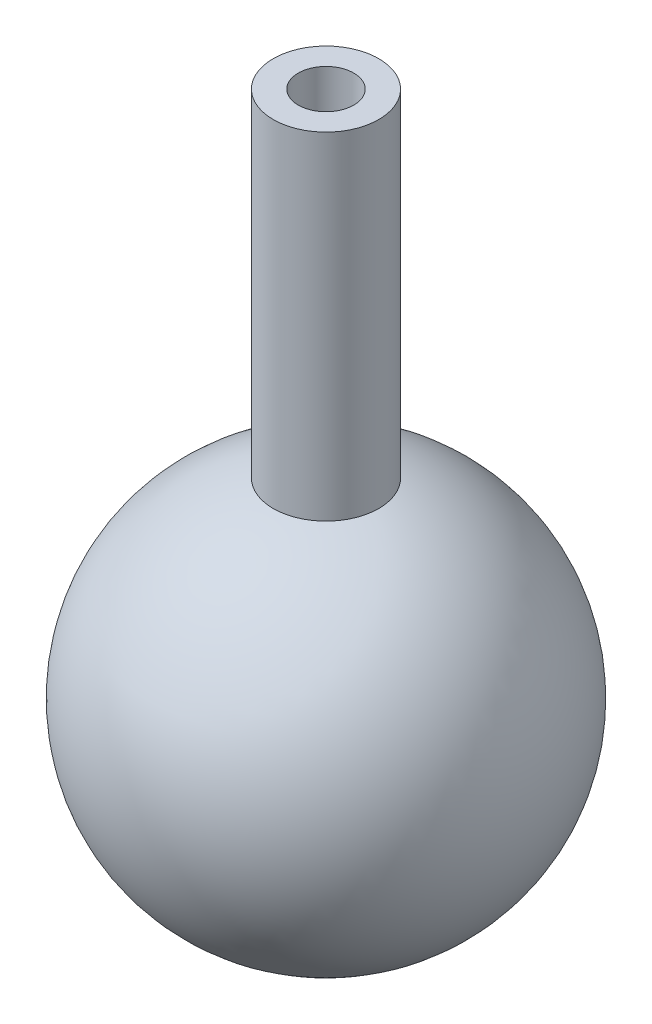
ISO-10303-21;
HEADER;
FILE_DESCRIPTION(('STEP AP214'),'2;1');
FILE_NAME('part.step','',(''),(''),'','','');
FILE_SCHEMA(('AUTOMOTIVE_DESIGN { 1 0 10303 214 1 1 1 1 }'));
ENDSEC;
DATA;
#1=APPLICATION_CONTEXT('core data for automotive mechanical design processes');
#2=APPLICATION_PROTOCOL_DEFINITION('international standard','automotive_design',2000,#1);
#3=PRODUCT_CONTEXT('',#1,'mechanical');
#4=PRODUCT('Part','Part','',(#3));
#5=PRODUCT_RELATED_PRODUCT_CATEGORY('part','',(#4));
#6=PRODUCT_DEFINITION_FORMATION('','',#4);
#7=PRODUCT_DEFINITION_CONTEXT('part definition',#1,'design');
#8=PRODUCT_DEFINITION('design','',#6,#7);
#9=PRODUCT_DEFINITION_SHAPE('','',#8);
#10=(LENGTH_UNIT() NAMED_UNIT(*) SI_UNIT(.MILLI.,.METRE.));
#11=(NAMED_UNIT(*) PLANE_ANGLE_UNIT() SI_UNIT($,.RADIAN.));
#12=(NAMED_UNIT(*) SI_UNIT($,.STERADIAN.) SOLID_ANGLE_UNIT());
#13=UNCERTAINTY_MEASURE_WITH_UNIT(LENGTH_MEASURE(1.E-05),#10,'distance_accuracy_value','');
#14=(GEOMETRIC_REPRESENTATION_CONTEXT(3) GLOBAL_UNCERTAINTY_ASSIGNED_CONTEXT((#13)) GLOBAL_UNIT_ASSIGNED_CONTEXT((#10,
#11,#12)) REPRESENTATION_CONTEXT('',''));
#15=CARTESIAN_POINT('',(0.,0.,0.));
#16=DIRECTION('',(0.,0.,1.));
#17=DIRECTION('',(1.,0.,0.));
#18=AXIS2_PLACEMENT_3D('',#15,#16,#17);
#19=CARTESIAN_POINT('',(0.,20.,0.));
#20=DIRECTION('',(0.,1.,0.));
#21=DIRECTION('',(0.,0.,1.));
#22=AXIS2_PLACEMENT_3D('',#19,#20,#21);
#23=CYLINDRICAL_SURFACE('',#22,8.);
#24=CARTESIAN_POINT('',(0.,80.,0.));
#25=DIRECTION('',(0.,1.,0.));
#26=DIRECTION('',(0.,0.,1.));
#27=AXIS2_PLACEMENT_3D('',#24,#25,#26);
#28=CIRCLE('',#27,8.);
#29=CARTESIAN_POINT('',(0.,80.,8.));
#30=VERTEX_POINT('',#29);
#31=EDGE_CURVE('E41',#30,#30,#28,.T.);
#32=ORIENTED_EDGE('',*,*,#31,.F.);
#33=EDGE_LOOP('',(#32));
#34=FACE_BOUND('',#33,.T.);
#35=CARTESIAN_POINT('',(0.,28.9136645896019,0.));
#36=DIRECTION('',(0.,-1.,0.));
#37=DIRECTION('',(0.,0.,-1.));
#38=AXIS2_PLACEMENT_3D('',#35,#36,#37);
#39=CIRCLE('',#38,8.);
#40=CARTESIAN_POINT('',(0.,28.9136645896019,-8.));
#41=VERTEX_POINT('',#40);
#42=EDGE_CURVE('E10',#41,#41,#39,.T.);
#43=ORIENTED_EDGE('',*,*,#42,.F.);
#44=EDGE_LOOP('',(#43));
#45=FACE_BOUND('',#44,.T.);
#46=ADVANCED_FACE('F34',(#34,#45),#23,.T.);
#47=CARTESIAN_POINT('',(0.,80.,0.));
#48=DIRECTION('',(0.,1.,0.));
#49=DIRECTION('',(0.,0.,1.));
#50=AXIS2_PLACEMENT_3D('',#47,#48,#49);
#51=PLANE('',#50);
#52=CARTESIAN_POINT('',(0.,80.,0.));
#53=DIRECTION('',(0.,1.,0.));
#54=DIRECTION('',(0.,0.,1.));
#55=AXIS2_PLACEMENT_3D('',#52,#53,#54);
#56=CIRCLE('',#55,4.21);
#57=CARTESIAN_POINT('',(0.,80.,4.21));
#58=VERTEX_POINT('',#57);
#59=EDGE_CURVE('E49',#58,#58,#56,.T.);
#60=ORIENTED_EDGE('',*,*,#59,.F.);
#61=EDGE_LOOP('',(#60));
#62=FACE_BOUND('',#61,.T.);
#63=ORIENTED_EDGE('',*,*,#31,.T.);
#64=EDGE_LOOP('',(#63));
#65=FACE_BOUND('',#64,.T.);
#66=ADVANCED_FACE('F57',(#62,#65),#51,.T.);
#67=CARTESIAN_POINT('',(0.,0.,0.));
#68=DIRECTION('',(0.,0.,-1.));
#69=DIRECTION('',(1.,0.,0.));
#70=AXIS2_PLACEMENT_3D('',#67,#68,#69);
#71=SPHERICAL_SURFACE('',#70,30.);
#72=CARTESIAN_POINT('',(0.,0.,0.));
#73=DIRECTION('',(0.,-1.,0.));
#74=DIRECTION('',(0.,0.,-1.));
#75=AXIS2_PLACEMENT_3D('',#72,#73,#74);
#76=SPHERICAL_SURFACE('',#75,30.);
#77=ORIENTED_EDGE('',*,*,#42,.T.);
#78=EDGE_LOOP('',(#77));
#79=FACE_BOUND('',#78,.T.);
#80=ADVANCED_FACE('F36',(#79),#76,.T.);
#81=CARTESIAN_POINT('',(0.,30.,0.));
#82=DIRECTION('',(0.,1.,0.));
#83=DIRECTION('',(0.,0.,1.));
#84=AXIS2_PLACEMENT_3D('',#81,#82,#83);
#85=CYLINDRICAL_SURFACE('',#84,4.21);
#86=CARTESIAN_POINT('',(0.,30.,0.));
#87=DIRECTION('',(0.,1.,0.));
#88=DIRECTION('',(0.,0.,1.));
#89=AXIS2_PLACEMENT_3D('',#86,#87,#88);
#90=CIRCLE('',#89,4.21);
#91=CARTESIAN_POINT('',(0.,30.,4.21));
#92=VERTEX_POINT('',#91);
#93=EDGE_CURVE('E45',#92,#92,#90,.T.);
#94=ORIENTED_EDGE('',*,*,#93,.F.);
#95=EDGE_LOOP('',(#94));
#96=FACE_BOUND('',#95,.T.);
#97=ORIENTED_EDGE('',*,*,#59,.T.);
#98=EDGE_LOOP('',(#97));
#99=FACE_BOUND('',#98,.T.);
#100=ADVANCED_FACE('F55',(#96,#99),#85,.F.);
#101=CARTESIAN_POINT('',(0.,30.,0.));
#102=DIRECTION('',(0.,1.,0.));
#103=DIRECTION('',(0.,0.,1.));
#104=AXIS2_PLACEMENT_3D('',#101,#102,#103);
#105=PLANE('',#104);
#106=ORIENTED_EDGE('',*,*,#93,.T.);
#107=EDGE_LOOP('',(#106));
#108=FACE_BOUND('',#107,.T.);
#109=ADVANCED_FACE('F68',(#108),#105,.T.);
#110=CLOSED_SHELL('',(#46,#66,#80,#100,#109));
#111=MANIFOLD_SOLID_BREP('B2',#110);
#112=ADVANCED_BREP_SHAPE_REPRESENTATION('',(#18,#111),#14);
#113=SHAPE_DEFINITION_REPRESENTATION(#9,#112);
ENDSEC;
END-ISO-10303-21;
